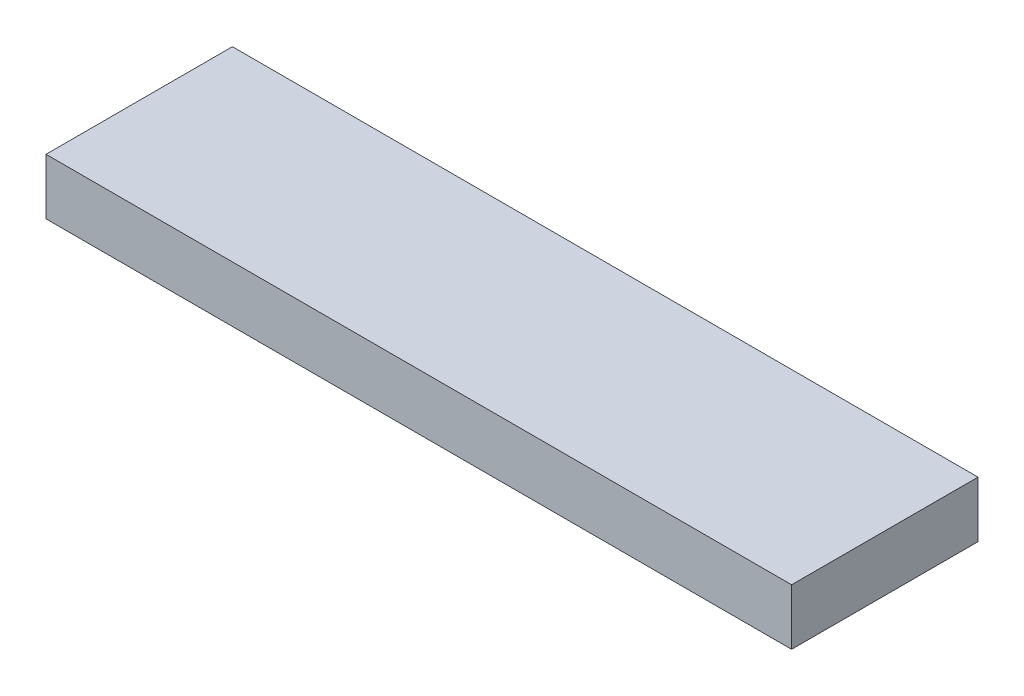
ISO-10303-21;
HEADER;
FILE_DESCRIPTION(('STEP AP214'),'2;1');
FILE_NAME('part.step','',(''),(''),'','','');
FILE_SCHEMA(('AUTOMOTIVE_DESIGN { 1 0 10303 214 1 1 1 1 }'));
ENDSEC;
DATA;
#1=APPLICATION_CONTEXT('core data for automotive mechanical design processes');
#2=APPLICATION_PROTOCOL_DEFINITION('international standard','automotive_design',2000,#1);
#3=PRODUCT_CONTEXT('',#1,'mechanical');
#4=PRODUCT('Part','Part','',(#3));
#5=PRODUCT_RELATED_PRODUCT_CATEGORY('part','',(#4));
#6=PRODUCT_DEFINITION_FORMATION('','',#4);
#7=PRODUCT_DEFINITION_CONTEXT('part definition',#1,'design');
#8=PRODUCT_DEFINITION('design','',#6,#7);
#9=PRODUCT_DEFINITION_SHAPE('','',#8);
#10=(LENGTH_UNIT() NAMED_UNIT(*) SI_UNIT(.MILLI.,.METRE.));
#11=(NAMED_UNIT(*) PLANE_ANGLE_UNIT() SI_UNIT($,.RADIAN.));
#12=(NAMED_UNIT(*) SI_UNIT($,.STERADIAN.) SOLID_ANGLE_UNIT());
#13=UNCERTAINTY_MEASURE_WITH_UNIT(LENGTH_MEASURE(1.E-05),#10,'distance_accuracy_value','');
#14=(GEOMETRIC_REPRESENTATION_CONTEXT(3) GLOBAL_UNCERTAINTY_ASSIGNED_CONTEXT((#13)) GLOBAL_UNIT_ASSIGNED_CONTEXT((#10,
#11,#12)) REPRESENTATION_CONTEXT('',''));
#15=CARTESIAN_POINT('',(0.,0.,0.));
#16=DIRECTION('',(0.,0.,1.));
#17=DIRECTION('',(1.,0.,0.));
#18=AXIS2_PLACEMENT_3D('',#15,#16,#17);
#19=CARTESIAN_POINT('',(100.,7.5,25.));
#20=DIRECTION('',(-1.,0.,0.));
#21=DIRECTION('',(0.,0.,1.));
#22=AXIS2_PLACEMENT_3D('',#19,#20,#21);
#23=PLANE('',#22);
#24=DIRECTION('',(0.,0.,-1.));
#25=VECTOR('',#24,1.);
#26=CARTESIAN_POINT('',(100.,-7.5,25.));
#27=LINE('',#26,#25);
#28=CARTESIAN_POINT('',(100.,-7.5,25.));
#29=VERTEX_POINT('',#28);
#30=CARTESIAN_POINT('',(100.,-7.5,-25.));
#31=VERTEX_POINT('',#30);
#32=EDGE_CURVE('E100',#29,#31,#27,.T.);
#33=ORIENTED_EDGE('',*,*,#32,.T.);
#34=DIRECTION('',(0.,-1.,0.));
#35=VECTOR('',#34,1.);
#36=CARTESIAN_POINT('',(100.,7.5,-25.));
#37=LINE('',#36,#35);
#38=CARTESIAN_POINT('',(100.,7.5,-25.));
#39=VERTEX_POINT('',#38);
#40=EDGE_CURVE('E11',#39,#31,#37,.T.);
#41=ORIENTED_EDGE('',*,*,#40,.F.);
#42=DIRECTION('',(0.,0.,-1.));
#43=VECTOR('',#42,1.);
#44=CARTESIAN_POINT('',(100.,7.5,25.));
#45=LINE('',#44,#43);
#46=CARTESIAN_POINT('',(100.,7.5,25.));
#47=VERTEX_POINT('',#46);
#48=EDGE_CURVE('E88',#47,#39,#45,.T.);
#49=ORIENTED_EDGE('',*,*,#48,.F.);
#50=DIRECTION('',(0.,-1.,0.));
#51=VECTOR('',#50,1.);
#52=CARTESIAN_POINT('',(100.,7.5,25.));
#53=LINE('',#52,#51);
#54=EDGE_CURVE('E96',#47,#29,#53,.T.);
#55=ORIENTED_EDGE('',*,*,#54,.T.);
#56=EDGE_LOOP('',(#33,#41,#49,#55));
#57=FACE_BOUND('',#56,.T.);
#58=ADVANCED_FACE('F37',(#57),#23,.F.);
#59=CARTESIAN_POINT('',(-100.,7.5,-25.));
#60=DIRECTION('',(0.,0.,1.));
#61=DIRECTION('',(1.,0.,0.));
#62=AXIS2_PLACEMENT_3D('',#59,#60,#61);
#63=PLANE('',#62);
#64=DIRECTION('',(-1.,0.,0.));
#65=VECTOR('',#64,1.);
#66=CARTESIAN_POINT('',(-100.,-7.5,-25.));
#67=LINE('',#66,#65);
#68=CARTESIAN_POINT('',(-100.,-7.5,-25.));
#69=VERTEX_POINT('',#68);
#70=EDGE_CURVE('E92',#31,#69,#67,.T.);
#71=ORIENTED_EDGE('',*,*,#70,.T.);
#72=DIRECTION('',(0.,-1.,0.));
#73=VECTOR('',#72,1.);
#74=CARTESIAN_POINT('',(-100.,7.5,-25.));
#75=LINE('',#74,#73);
#76=CARTESIAN_POINT('',(-100.,7.5,-25.));
#77=VERTEX_POINT('',#76);
#78=EDGE_CURVE('E45',#77,#69,#75,.T.);
#79=ORIENTED_EDGE('',*,*,#78,.F.);
#80=DIRECTION('',(-1.,0.,0.));
#81=VECTOR('',#80,1.);
#82=CARTESIAN_POINT('',(-100.,7.5,-25.));
#83=LINE('',#82,#81);
#84=EDGE_CURVE('E83',#39,#77,#83,.T.);
#85=ORIENTED_EDGE('',*,*,#84,.F.);
#86=ORIENTED_EDGE('',*,*,#40,.T.);
#87=EDGE_LOOP('',(#71,#79,#85,#86));
#88=FACE_BOUND('',#87,.T.);
#89=ADVANCED_FACE('F91',(#88),#63,.F.);
#90=CARTESIAN_POINT('',(-100.,7.5,25.));
#91=DIRECTION('',(1.,0.,0.));
#92=DIRECTION('',(0.,0.,-1.));
#93=AXIS2_PLACEMENT_3D('',#90,#91,#92);
#94=PLANE('',#93);
#95=DIRECTION('',(0.,0.,1.));
#96=VECTOR('',#95,1.);
#97=CARTESIAN_POINT('',(-100.,-7.5,25.));
#98=LINE('',#97,#96);
#99=CARTESIAN_POINT('',(-100.,-7.5,25.));
#100=VERTEX_POINT('',#99);
#101=EDGE_CURVE('E70',#69,#100,#98,.T.);
#102=ORIENTED_EDGE('',*,*,#101,.T.);
#103=DIRECTION('',(0.,-1.,0.));
#104=VECTOR('',#103,1.);
#105=CARTESIAN_POINT('',(-100.,7.5,25.));
#106=LINE('',#105,#104);
#107=CARTESIAN_POINT('',(-100.,7.5,25.));
#108=VERTEX_POINT('',#107);
#109=EDGE_CURVE('E93',#108,#100,#106,.T.);
#110=ORIENTED_EDGE('',*,*,#109,.F.);
#111=DIRECTION('',(0.,0.,1.));
#112=VECTOR('',#111,1.);
#113=CARTESIAN_POINT('',(-100.,7.5,25.));
#114=LINE('',#113,#112);
#115=EDGE_CURVE('E86',#77,#108,#114,.T.);
#116=ORIENTED_EDGE('',*,*,#115,.F.);
#117=ORIENTED_EDGE('',*,*,#78,.T.);
#118=EDGE_LOOP('',(#102,#110,#116,#117));
#119=FACE_BOUND('',#118,.T.);
#120=ADVANCED_FACE('F94',(#119),#94,.F.);
#121=CARTESIAN_POINT('',(-100.,7.5,25.));
#122=DIRECTION('',(0.,0.,-1.));
#123=DIRECTION('',(-1.,0.,0.));
#124=AXIS2_PLACEMENT_3D('',#121,#122,#123);
#125=PLANE('',#124);
#126=DIRECTION('',(1.,0.,0.));
#127=VECTOR('',#126,1.);
#128=CARTESIAN_POINT('',(-100.,-7.5,25.));
#129=LINE('',#128,#127);
#130=EDGE_CURVE('E76',#100,#29,#129,.T.);
#131=ORIENTED_EDGE('',*,*,#130,.T.);
#132=ORIENTED_EDGE('',*,*,#54,.F.);
#133=DIRECTION('',(1.,0.,0.));
#134=VECTOR('',#133,1.);
#135=CARTESIAN_POINT('',(-100.,7.5,25.));
#136=LINE('',#135,#134);
#137=EDGE_CURVE('E53',#108,#47,#136,.T.);
#138=ORIENTED_EDGE('',*,*,#137,.F.);
#139=ORIENTED_EDGE('',*,*,#109,.T.);
#140=EDGE_LOOP('',(#131,#132,#138,#139));
#141=FACE_BOUND('',#140,.T.);
#142=ADVANCED_FACE('F107',(#141),#125,.F.);
#143=CARTESIAN_POINT('',(0.,7.5,0.));
#144=DIRECTION('',(0.,-1.,0.));
#145=DIRECTION('',(0.,0.,-1.));
#146=AXIS2_PLACEMENT_3D('',#143,#144,#145);
#147=PLANE('',#146);
#148=ORIENTED_EDGE('',*,*,#48,.T.);
#149=ORIENTED_EDGE('',*,*,#84,.T.);
#150=ORIENTED_EDGE('',*,*,#115,.T.);
#151=ORIENTED_EDGE('',*,*,#137,.T.);
#152=EDGE_LOOP('',(#148,#149,#150,#151));
#153=FACE_BOUND('',#152,.T.);
#154=ADVANCED_FACE('F84',(#153),#147,.F.);
#155=CARTESIAN_POINT('',(0.,-7.5,0.));
#156=DIRECTION('',(0.,-1.,0.));
#157=DIRECTION('',(0.,0.,-1.));
#158=AXIS2_PLACEMENT_3D('',#155,#156,#157);
#159=PLANE('',#158);
#160=ORIENTED_EDGE('',*,*,#32,.F.);
#161=ORIENTED_EDGE('',*,*,#130,.F.);
#162=ORIENTED_EDGE('',*,*,#101,.F.);
#163=ORIENTED_EDGE('',*,*,#70,.F.);
#164=EDGE_LOOP('',(#160,#161,#162,#163));
#165=FACE_BOUND('',#164,.T.);
#166=ADVANCED_FACE('F110',(#165),#159,.T.);
#167=CLOSED_SHELL('',(#58,#89,#120,#142,#154,#166));
#168=MANIFOLD_SOLID_BREP('B2',#167);
#169=ADVANCED_BREP_SHAPE_REPRESENTATION('',(#18,#168),#14);
#170=SHAPE_DEFINITION_REPRESENTATION(#9,#169);
ENDSEC;
END-ISO-10303-21;
